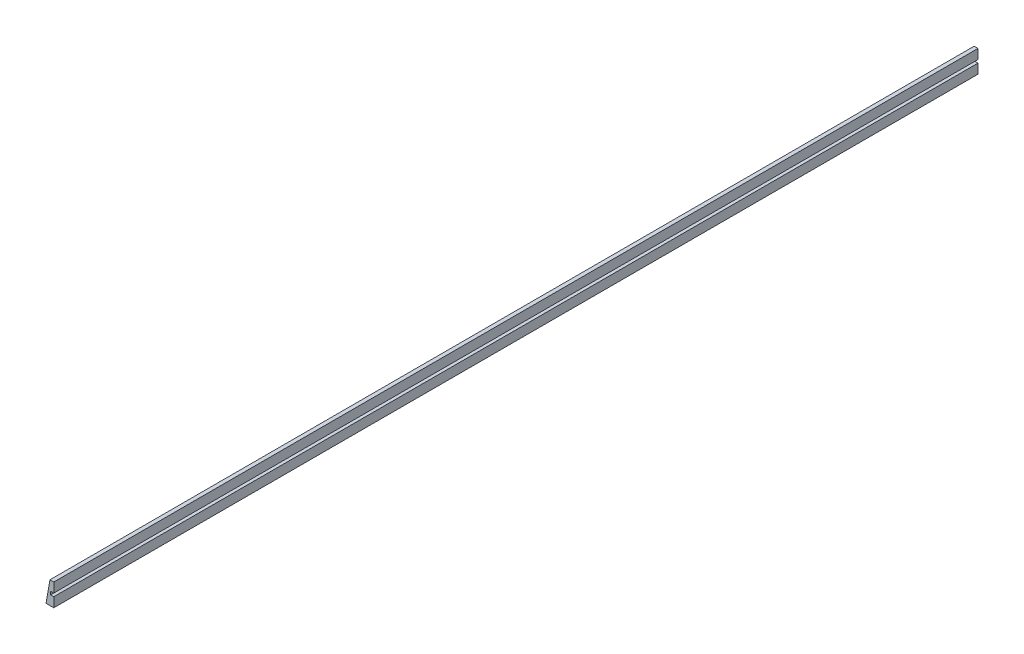
ISO-10303-21;
HEADER;
FILE_DESCRIPTION(('STEP AP214'),'2;1');
FILE_NAME('part.step','',(''),(''),'','','');
FILE_SCHEMA(('AUTOMOTIVE_DESIGN { 1 0 10303 214 1 1 1 1 }'));
ENDSEC;
DATA;
#1=APPLICATION_CONTEXT('core data for automotive mechanical design processes');
#2=APPLICATION_PROTOCOL_DEFINITION('international standard','automotive_design',2000,#1);
#3=PRODUCT_CONTEXT('',#1,'mechanical');
#4=PRODUCT('Part','Part','',(#3));
#5=PRODUCT_RELATED_PRODUCT_CATEGORY('part','',(#4));
#6=PRODUCT_DEFINITION_FORMATION('','',#4);
#7=PRODUCT_DEFINITION_CONTEXT('part definition',#1,'design');
#8=PRODUCT_DEFINITION('design','',#6,#7);
#9=PRODUCT_DEFINITION_SHAPE('','',#8);
#10=(LENGTH_UNIT() NAMED_UNIT(*) SI_UNIT(.MILLI.,.METRE.));
#11=(NAMED_UNIT(*) PLANE_ANGLE_UNIT() SI_UNIT($,.RADIAN.));
#12=(NAMED_UNIT(*) SI_UNIT($,.STERADIAN.) SOLID_ANGLE_UNIT());
#13=UNCERTAINTY_MEASURE_WITH_UNIT(LENGTH_MEASURE(1.E-05),#10,'distance_accuracy_value','');
#14=(GEOMETRIC_REPRESENTATION_CONTEXT(3) GLOBAL_UNCERTAINTY_ASSIGNED_CONTEXT((#13)) GLOBAL_UNIT_ASSIGNED_CONTEXT((#10,
#11,#12)) REPRESENTATION_CONTEXT('',''));
#15=CARTESIAN_POINT('',(0.,0.,0.));
#16=DIRECTION('',(0.,0.,1.));
#17=DIRECTION('',(1.,0.,0.));
#18=AXIS2_PLACEMENT_3D('',#15,#16,#17);
#19=CARTESIAN_POINT('',(3.175,-2.54,762.));
#20=DIRECTION('',(-1.,0.,0.));
#21=DIRECTION('',(0.,0.,1.));
#22=AXIS2_PLACEMENT_3D('',#19,#20,#21);
#23=PLANE('',#22);
#24=DIRECTION('',(0.,1.,0.));
#25=VECTOR('',#24,1.);
#26=CARTESIAN_POINT('',(3.175,-2.54,-762.));
#27=LINE('',#26,#25);
#28=CARTESIAN_POINT('',(3.175,-18.415,-762.));
#29=VERTEX_POINT('',#28);
#30=CARTESIAN_POINT('',(3.175,-2.54,-762.));
#31=VERTEX_POINT('',#30);
#32=EDGE_CURVE('E127',#29,#31,#27,.T.);
#33=ORIENTED_EDGE('',*,*,#32,.T.);
#34=DIRECTION('',(0.,0.,-1.));
#35=VECTOR('',#34,1.);
#36=CARTESIAN_POINT('',(3.175,-2.54,762.));
#37=LINE('',#36,#35);
#38=CARTESIAN_POINT('',(3.175,-2.54,762.));
#39=VERTEX_POINT('',#38);
#40=EDGE_CURVE('E11',#39,#31,#37,.T.);
#41=ORIENTED_EDGE('',*,*,#40,.F.);
#42=DIRECTION('',(0.,1.,0.));
#43=VECTOR('',#42,1.);
#44=CARTESIAN_POINT('',(3.175,-2.54,762.));
#45=LINE('',#44,#43);
#46=CARTESIAN_POINT('',(3.175,-18.415,762.));
#47=VERTEX_POINT('',#46);
#48=EDGE_CURVE('E141',#47,#39,#45,.T.);
#49=ORIENTED_EDGE('',*,*,#48,.F.);
#50=DIRECTION('',(0.,0.,-1.));
#51=VECTOR('',#50,1.);
#52=CARTESIAN_POINT('',(3.175,-18.415,762.));
#53=LINE('',#52,#51);
#54=EDGE_CURVE('E123',#47,#29,#53,.T.);
#55=ORIENTED_EDGE('',*,*,#54,.T.);
#56=EDGE_LOOP('',(#33,#41,#49,#55));
#57=FACE_BOUND('',#56,.T.);
#58=ADVANCED_FACE('F34',(#57),#23,.F.);
#59=CARTESIAN_POINT('',(-1.905,-2.54,762.));
#60=DIRECTION('',(0.,-1.,0.));
#61=DIRECTION('',(1.,0.,0.));
#62=AXIS2_PLACEMENT_3D('',#59,#60,#61);
#63=PLANE('',#62);
#64=DIRECTION('',(-1.,0.,0.));
#65=VECTOR('',#64,1.);
#66=CARTESIAN_POINT('',(-1.905,-2.54,-762.));
#67=LINE('',#66,#65);
#68=CARTESIAN_POINT('',(-1.905,-2.54,-762.));
#69=VERTEX_POINT('',#68);
#70=EDGE_CURVE('E130',#31,#69,#67,.T.);
#71=ORIENTED_EDGE('',*,*,#70,.T.);
#72=DIRECTION('',(0.,0.,-1.));
#73=VECTOR('',#72,1.);
#74=CARTESIAN_POINT('',(-1.905,-2.54,762.));
#75=LINE('',#74,#73);
#76=CARTESIAN_POINT('',(-1.905,-2.54,762.));
#77=VERTEX_POINT('',#76);
#78=EDGE_CURVE('E42',#77,#69,#75,.T.);
#79=ORIENTED_EDGE('',*,*,#78,.F.);
#80=DIRECTION('',(-1.,0.,0.));
#81=VECTOR('',#80,1.);
#82=CARTESIAN_POINT('',(-1.905,-2.54,762.));
#83=LINE('',#82,#81);
#84=EDGE_CURVE('E90',#39,#77,#83,.T.);
#85=ORIENTED_EDGE('',*,*,#84,.F.);
#86=ORIENTED_EDGE('',*,*,#40,.T.);
#87=EDGE_LOOP('',(#71,#79,#85,#86));
#88=FACE_BOUND('',#87,.T.);
#89=ADVANCED_FACE('F180',(#88),#63,.F.);
#90=CARTESIAN_POINT('',(-1.905,2.54,762.));
#91=DIRECTION('',(-1.,0.,0.));
#92=DIRECTION('',(0.,0.,1.));
#93=AXIS2_PLACEMENT_3D('',#90,#91,#92);
#94=PLANE('',#93);
#95=DIRECTION('',(0.,1.,0.));
#96=VECTOR('',#95,1.);
#97=CARTESIAN_POINT('',(-1.905,2.54,-762.));
#98=LINE('',#97,#96);
#99=CARTESIAN_POINT('',(-1.905,2.54,-762.));
#100=VERTEX_POINT('',#99);
#101=EDGE_CURVE('E133',#69,#100,#98,.T.);
#102=ORIENTED_EDGE('',*,*,#101,.T.);
#103=DIRECTION('',(0.,0.,-1.));
#104=VECTOR('',#103,1.);
#105=CARTESIAN_POINT('',(-1.905,2.54,762.));
#106=LINE('',#105,#104);
#107=CARTESIAN_POINT('',(-1.905,2.54,762.));
#108=VERTEX_POINT('',#107);
#109=EDGE_CURVE('E145',#108,#100,#106,.T.);
#110=ORIENTED_EDGE('',*,*,#109,.F.);
#111=DIRECTION('',(0.,1.,0.));
#112=VECTOR('',#111,1.);
#113=CARTESIAN_POINT('',(-1.905,2.54,762.));
#114=LINE('',#113,#112);
#115=EDGE_CURVE('E153',#77,#108,#114,.T.);
#116=ORIENTED_EDGE('',*,*,#115,.F.);
#117=ORIENTED_EDGE('',*,*,#78,.T.);
#118=EDGE_LOOP('',(#102,#110,#116,#117));
#119=FACE_BOUND('',#118,.T.);
#120=ADVANCED_FACE('F151',(#119),#94,.F.);
#121=CARTESIAN_POINT('',(3.175,2.54,762.));
#122=DIRECTION('',(0.,1.,0.));
#123=DIRECTION('',(-1.,0.,0.));
#124=AXIS2_PLACEMENT_3D('',#121,#122,#123);
#125=PLANE('',#124);
#126=DIRECTION('',(1.,0.,0.));
#127=VECTOR('',#126,1.);
#128=CARTESIAN_POINT('',(3.175,2.54,-762.));
#129=LINE('',#128,#127);
#130=CARTESIAN_POINT('',(3.175,2.54,-762.));
#131=VERTEX_POINT('',#130);
#132=EDGE_CURVE('E135',#100,#131,#129,.T.);
#133=ORIENTED_EDGE('',*,*,#132,.T.);
#134=DIRECTION('',(0.,0.,-1.));
#135=VECTOR('',#134,1.);
#136=CARTESIAN_POINT('',(3.175,2.54,762.));
#137=LINE('',#136,#135);
#138=CARTESIAN_POINT('',(3.175,2.54,762.));
#139=VERTEX_POINT('',#138);
#140=EDGE_CURVE('E116',#139,#131,#137,.T.);
#141=ORIENTED_EDGE('',*,*,#140,.F.);
#142=DIRECTION('',(1.,0.,0.));
#143=VECTOR('',#142,1.);
#144=CARTESIAN_POINT('',(3.175,2.54,762.));
#145=LINE('',#144,#143);
#146=EDGE_CURVE('E108',#108,#139,#145,.T.);
#147=ORIENTED_EDGE('',*,*,#146,.F.);
#148=ORIENTED_EDGE('',*,*,#109,.T.);
#149=EDGE_LOOP('',(#133,#141,#147,#148));
#150=FACE_BOUND('',#149,.T.);
#151=ADVANCED_FACE('F159',(#150),#125,.F.);
#152=CARTESIAN_POINT('',(3.175,18.415,762.));
#153=DIRECTION('',(-1.,0.,0.));
#154=DIRECTION('',(0.,-1.,0.));
#155=AXIS2_PLACEMENT_3D('',#152,#153,#154);
#156=PLANE('',#155);
#157=DIRECTION('',(0.,1.,0.));
#158=VECTOR('',#157,1.);
#159=CARTESIAN_POINT('',(3.175,18.415,-762.));
#160=LINE('',#159,#158);
#161=CARTESIAN_POINT('',(3.175,18.415,-762.));
#162=VERTEX_POINT('',#161);
#163=EDGE_CURVE('E75',#131,#162,#160,.T.);
#164=ORIENTED_EDGE('',*,*,#163,.T.);
#165=DIRECTION('',(0.,0.,-1.));
#166=VECTOR('',#165,1.);
#167=CARTESIAN_POINT('',(3.175,18.415,762.));
#168=LINE('',#167,#166);
#169=CARTESIAN_POINT('',(3.175,18.415,762.));
#170=VERTEX_POINT('',#169);
#171=EDGE_CURVE('E111',#170,#162,#168,.T.);
#172=ORIENTED_EDGE('',*,*,#171,.F.);
#173=DIRECTION('',(0.,1.,0.));
#174=VECTOR('',#173,1.);
#175=CARTESIAN_POINT('',(3.175,18.415,762.));
#176=LINE('',#175,#174);
#177=EDGE_CURVE('E102',#139,#170,#176,.T.);
#178=ORIENTED_EDGE('',*,*,#177,.F.);
#179=ORIENTED_EDGE('',*,*,#140,.T.);
#180=EDGE_LOOP('',(#164,#172,#178,#179));
#181=FACE_BOUND('',#180,.T.);
#182=ADVANCED_FACE('F112',(#181),#156,.F.);
#183=CARTESIAN_POINT('',(-3.175,18.415,762.));
#184=DIRECTION('',(0.,-1.,0.));
#185=DIRECTION('',(0.,0.,-1.));
#186=AXIS2_PLACEMENT_3D('',#183,#184,#185);
#187=PLANE('',#186);
#188=DIRECTION('',(-1.,0.,0.));
#189=VECTOR('',#188,1.);
#190=CARTESIAN_POINT('',(-3.175,18.415,-762.));
#191=LINE('',#190,#189);
#192=CARTESIAN_POINT('',(-3.175,18.415,-762.));
#193=VERTEX_POINT('',#192);
#194=EDGE_CURVE('E138',#162,#193,#191,.T.);
#195=ORIENTED_EDGE('',*,*,#194,.T.);
#196=DIRECTION('',(0.,0.,-1.));
#197=VECTOR('',#196,1.);
#198=CARTESIAN_POINT('',(-3.175,18.415,762.));
#199=LINE('',#198,#197);
#200=CARTESIAN_POINT('',(-3.175,18.415,762.));
#201=VERTEX_POINT('',#200);
#202=EDGE_CURVE('E117',#201,#193,#199,.T.);
#203=ORIENTED_EDGE('',*,*,#202,.F.);
#204=DIRECTION('',(-1.,0.,0.));
#205=VECTOR('',#204,1.);
#206=CARTESIAN_POINT('',(-3.175,18.415,762.));
#207=LINE('',#206,#205);
#208=EDGE_CURVE('E105',#170,#201,#207,.T.);
#209=ORIENTED_EDGE('',*,*,#208,.F.);
#210=ORIENTED_EDGE('',*,*,#171,.T.);
#211=EDGE_LOOP('',(#195,#203,#209,#210));
#212=FACE_BOUND('',#211,.T.);
#213=ADVANCED_FACE('F119',(#212),#187,.F.);
#214=CARTESIAN_POINT('',(-3.175,-18.415,762.));
#215=DIRECTION('',(0.,1.,0.));
#216=DIRECTION('',(0.,0.,1.));
#217=AXIS2_PLACEMENT_3D('',#214,#215,#216);
#218=PLANE('',#217);
#219=DIRECTION('',(1.,0.,0.));
#220=VECTOR('',#219,1.);
#221=CARTESIAN_POINT('',(-3.175,-18.415,-762.));
#222=LINE('',#221,#220);
#223=CARTESIAN_POINT('',(-9.6691226994925,-18.415,-762.));
#224=VERTEX_POINT('',#223);
#225=EDGE_CURVE('E82',#224,#29,#222,.T.);
#226=ORIENTED_EDGE('',*,*,#225,.T.);
#227=ORIENTED_EDGE('',*,*,#54,.F.);
#228=DIRECTION('',(1.,0.,0.));
#229=VECTOR('',#228,1.);
#230=CARTESIAN_POINT('',(-3.175,-18.415,762.));
#231=LINE('',#230,#229);
#232=CARTESIAN_POINT('',(-9.6691226994925,-18.415,762.));
#233=VERTEX_POINT('',#232);
#234=EDGE_CURVE('E50',#233,#47,#231,.T.);
#235=ORIENTED_EDGE('',*,*,#234,.F.);
#236=DIRECTION('',(0.,0.,-1.));
#237=VECTOR('',#236,1.);
#238=CARTESIAN_POINT('',(-9.6691226994925,-18.415,799.398162115752));
#239=LINE('',#238,#237);
#240=EDGE_CURVE('E164',#233,#224,#239,.T.);
#241=ORIENTED_EDGE('',*,*,#240,.T.);
#242=EDGE_LOOP('',(#226,#227,#235,#241));
#243=FACE_BOUND('',#242,.T.);
#244=ADVANCED_FACE('F176',(#243),#218,.F.);
#245=CARTESIAN_POINT('',(0.,0.,762.));
#246=DIRECTION('',(0.,0.,1.));
#247=DIRECTION('',(1.,0.,0.));
#248=AXIS2_PLACEMENT_3D('',#245,#246,#247);
#249=PLANE('',#248);
#250=ORIENTED_EDGE('',*,*,#48,.T.);
#251=ORIENTED_EDGE('',*,*,#84,.T.);
#252=ORIENTED_EDGE('',*,*,#115,.T.);
#253=ORIENTED_EDGE('',*,*,#146,.T.);
#254=ORIENTED_EDGE('',*,*,#177,.T.);
#255=ORIENTED_EDGE('',*,*,#208,.T.);
#256=DIRECTION('',(-0.173648177666924,-0.984807753012209,0.));
#257=VECTOR('',#256,1.);
#258=CARTESIAN_POINT('',(-9.6691226994925,-18.415,762.));
#259=LINE('',#258,#257);
#260=EDGE_CURVE('E131',#201,#233,#259,.T.);
#261=ORIENTED_EDGE('',*,*,#260,.T.);
#262=ORIENTED_EDGE('',*,*,#234,.T.);
#263=EDGE_LOOP('',(#250,#251,#252,#253,#254,#255,#261,#262));
#264=FACE_BOUND('',#263,.T.);
#265=ADVANCED_FACE('F103',(#264),#249,.T.);
#266=CARTESIAN_POINT('',(0.,0.,-762.));
#267=DIRECTION('',(0.,0.,1.));
#268=DIRECTION('',(1.,0.,0.));
#269=AXIS2_PLACEMENT_3D('',#266,#267,#268);
#270=PLANE('',#269);
#271=ORIENTED_EDGE('',*,*,#32,.F.);
#272=ORIENTED_EDGE('',*,*,#225,.F.);
#273=DIRECTION('',(0.173648177666924,0.984807753012209,0.));
#274=VECTOR('',#273,1.);
#275=CARTESIAN_POINT('',(-9.6691226994925,-18.415,-762.));
#276=LINE('',#275,#274);
#277=EDGE_CURVE('E166',#224,#193,#276,.T.);
#278=ORIENTED_EDGE('',*,*,#277,.T.);
#279=ORIENTED_EDGE('',*,*,#194,.F.);
#280=ORIENTED_EDGE('',*,*,#163,.F.);
#281=ORIENTED_EDGE('',*,*,#132,.F.);
#282=ORIENTED_EDGE('',*,*,#101,.F.);
#283=ORIENTED_EDGE('',*,*,#70,.F.);
#284=EDGE_LOOP('',(#271,#272,#278,#279,#280,#281,#282,#283));
#285=FACE_BOUND('',#284,.T.);
#286=ADVANCED_FACE('F157',(#285),#270,.F.);
#287=CARTESIAN_POINT('',(-9.6691226994925,-18.415,799.398162115752));
#288=DIRECTION('',(0.984807753012209,-0.173648177666924,0.));
#289=DIRECTION('',(0.173648177666924,0.984807753012209,0.));
#290=AXIS2_PLACEMENT_3D('',#287,#288,#289);
#291=PLANE('',#290);
#292=ORIENTED_EDGE('',*,*,#260,.F.);
#293=ORIENTED_EDGE('',*,*,#202,.T.);
#294=ORIENTED_EDGE('',*,*,#277,.F.);
#295=ORIENTED_EDGE('',*,*,#240,.F.);
#296=EDGE_LOOP('',(#292,#293,#294,#295));
#297=FACE_BOUND('',#296,.T.);
#298=ADVANCED_FACE('F174',(#297),#291,.F.);
#299=CLOSED_SHELL('',(#58,#89,#120,#151,#182,#213,#244,#265,#286,#298));
#300=MANIFOLD_SOLID_BREP('B2',#299);
#301=ADVANCED_BREP_SHAPE_REPRESENTATION('',(#18,#300),#14);
#302=SHAPE_DEFINITION_REPRESENTATION(#9,#301);
ENDSEC;
END-ISO-10303-21;
